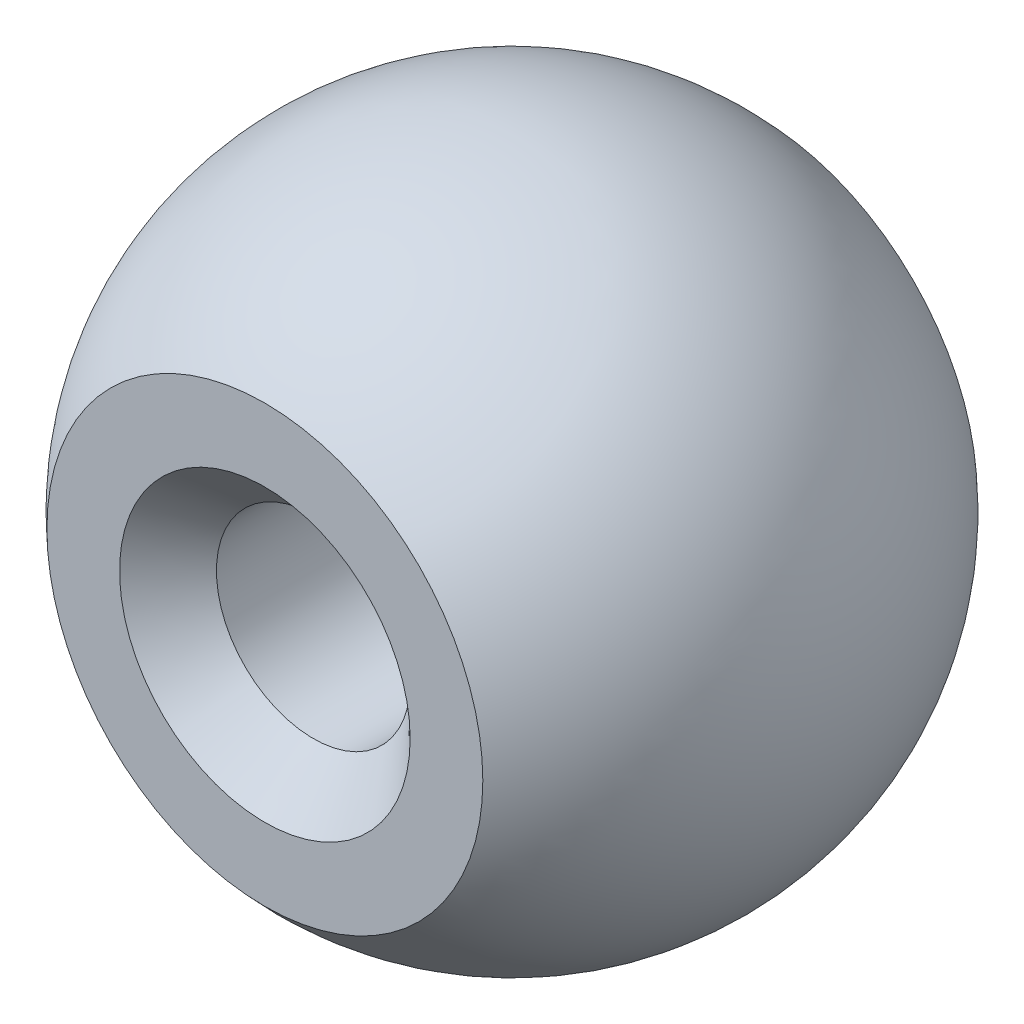
ISO-10303-21;
HEADER;
FILE_DESCRIPTION(('STEP AP214'),'2;1');
FILE_NAME('part.step','',(''),(''),'','','');
FILE_SCHEMA(('AUTOMOTIVE_DESIGN { 1 0 10303 214 1 1 1 1 }'));
ENDSEC;
DATA;
#1=APPLICATION_CONTEXT('core data for automotive mechanical design processes');
#2=APPLICATION_PROTOCOL_DEFINITION('international standard','automotive_design',2000,#1);
#3=PRODUCT_CONTEXT('',#1,'mechanical');
#4=PRODUCT('Part','Part','',(#3));
#5=PRODUCT_RELATED_PRODUCT_CATEGORY('part','',(#4));
#6=PRODUCT_DEFINITION_FORMATION('','',#4);
#7=PRODUCT_DEFINITION_CONTEXT('part definition',#1,'design');
#8=PRODUCT_DEFINITION('design','',#6,#7);
#9=PRODUCT_DEFINITION_SHAPE('','',#8);
#10=(LENGTH_UNIT() NAMED_UNIT(*) SI_UNIT(.MILLI.,.METRE.));
#11=(NAMED_UNIT(*) PLANE_ANGLE_UNIT() SI_UNIT($,.RADIAN.));
#12=(NAMED_UNIT(*) SI_UNIT($,.STERADIAN.) SOLID_ANGLE_UNIT());
#13=UNCERTAINTY_MEASURE_WITH_UNIT(LENGTH_MEASURE(1.E-05),#10,'distance_accuracy_value','');
#14=(GEOMETRIC_REPRESENTATION_CONTEXT(3) GLOBAL_UNCERTAINTY_ASSIGNED_CONTEXT((#13)) GLOBAL_UNIT_ASSIGNED_CONTEXT((#10,
#11,#12)) REPRESENTATION_CONTEXT('',''));
#15=CARTESIAN_POINT('',(0.,0.,0.));
#16=DIRECTION('',(0.,0.,1.));
#17=DIRECTION('',(1.,0.,0.));
#18=AXIS2_PLACEMENT_3D('',#15,#16,#17);
#19=CARTESIAN_POINT('',(0.,0.,-5.10252038562457));
#20=DIRECTION('',(0.,0.,-1.));
#21=DIRECTION('',(-1.,0.,0.));
#22=AXIS2_PLACEMENT_3D('',#19,#20,#21);
#23=PLANE('',#22);
#24=CARTESIAN_POINT('',(0.,0.,-5.10252038562457));
#25=DIRECTION('',(0.,0.,1.));
#26=DIRECTION('',(1.,0.,0.));
#27=AXIS2_PLACEMENT_3D('',#24,#25,#26);
#28=CIRCLE('',#27,2.);
#29=CARTESIAN_POINT('',(2.,0.,-5.10252038562457));
#30=VERTEX_POINT('',#29);
#31=EDGE_CURVE('E44',#30,#30,#28,.T.);
#32=ORIENTED_EDGE('',*,*,#31,.T.);
#33=EDGE_LOOP('',(#32));
#34=FACE_BOUND('',#33,.T.);
#35=CARTESIAN_POINT('',(0.,0.,-5.10252038562457));
#36=DIRECTION('',(0.,0.,1.));
#37=DIRECTION('',(1.,0.,0.));
#38=AXIS2_PLACEMENT_3D('',#35,#36,#37);
#39=CIRCLE('',#38,4.5);
#40=CARTESIAN_POINT('',(4.5,0.,-5.10252038562457));
#41=VERTEX_POINT('',#40);
#42=EDGE_CURVE('E40',#41,#41,#39,.T.);
#43=ORIENTED_EDGE('',*,*,#42,.F.);
#44=EDGE_LOOP('',(#43));
#45=FACE_BOUND('',#44,.T.);
#46=ADVANCED_FACE('F34',(#34,#45),#23,.T.);
#47=CARTESIAN_POINT('',(0.,0.,5.10252038562457));
#48=DIRECTION('',(0.,0.,1.));
#49=DIRECTION('',(1.,0.,0.));
#50=AXIS2_PLACEMENT_3D('',#47,#48,#49);
#51=PLANE('',#50);
#52=CARTESIAN_POINT('',(0.,0.,5.10252038562457));
#53=DIRECTION('',(0.,0.,1.));
#54=DIRECTION('',(1.,0.,0.));
#55=AXIS2_PLACEMENT_3D('',#52,#53,#54);
#56=CIRCLE('',#55,3.);
#57=CARTESIAN_POINT('',(3.,0.,5.10252038562457));
#58=VERTEX_POINT('',#57);
#59=EDGE_CURVE('E53',#58,#58,#56,.T.);
#60=ORIENTED_EDGE('',*,*,#59,.F.);
#61=EDGE_LOOP('',(#60));
#62=FACE_BOUND('',#61,.T.);
#63=CARTESIAN_POINT('',(0.,0.,5.10252038562457));
#64=DIRECTION('',(0.,0.,1.));
#65=DIRECTION('',(1.,0.,0.));
#66=AXIS2_PLACEMENT_3D('',#63,#64,#65);
#67=CIRCLE('',#66,4.5);
#68=CARTESIAN_POINT('',(4.5,0.,5.10252038562457));
#69=VERTEX_POINT('',#68);
#70=EDGE_CURVE('E10',#69,#69,#67,.T.);
#71=ORIENTED_EDGE('',*,*,#70,.T.);
#72=EDGE_LOOP('',(#71));
#73=FACE_BOUND('',#72,.T.);
#74=ADVANCED_FACE('F59',(#62,#73),#51,.T.);
#75=CARTESIAN_POINT('',(0.,0.,0.));
#76=DIRECTION('',(0.,0.,1.));
#77=DIRECTION('',(1.,0.,0.));
#78=AXIS2_PLACEMENT_3D('',#75,#76,#77);
#79=SPHERICAL_SURFACE('',#78,6.80336051416609);
#80=CARTESIAN_POINT('',(4.5,0.,-5.10252038562457));
#81=CARTESIAN_POINT('',(4.59015337255352,0.,-5.02301686365737));
#82=CARTESIAN_POINT('',(4.67819529523904,0.,-4.94111962845658));
#83=CARTESIAN_POINT('',(4.84981883325199,0.,-4.77277783394915));
#84=CARTESIAN_POINT('',(4.93340044857941,0.,-4.68633327464251));
#85=CARTESIAN_POINT('',(5.09586596425406,0.,-4.50913693428469));
#86=CARTESIAN_POINT('',(5.17474986460128,0.,-4.41838515323351));
#87=CARTESIAN_POINT('',(5.32759909425923,0.,-4.23282999200353));
#88=CARTESIAN_POINT('',(5.40156442356996,0.,-4.13802661182474));
#89=CARTESIAN_POINT('',(5.54436857068977,0.,-3.94463433788936));
#90=CARTESIAN_POINT('',(5.61320738849885,0.,-3.84604544413277));
#91=CARTESIAN_POINT('',(5.74556521226832,0.,-3.64535910687888));
#92=CARTESIAN_POINT('',(5.80908421822871,0.,-3.54326166338158));
#93=CARTESIAN_POINT('',(5.93062399541599,0.,-3.3358449792967));
#94=CARTESIAN_POINT('',(5.98864476664288,0.,-3.23052573870912));
#95=CARTESIAN_POINT('',(6.09902511196882,0.,-3.01696127996971));
#96=CARTESIAN_POINT('',(6.15138468606787,0.,-2.90871606181788));
#97=CARTESIAN_POINT('',(6.25029557101517,0.,-2.68960368109908));
#98=CARTESIAN_POINT('',(6.29684688186342,0.,-2.5787365185321));
#99=CARTESIAN_POINT('',(6.38401048940892,0.,-2.35469164779456));
#100=CARTESIAN_POINT('',(6.42462278610617,0.,-2.24151393962399));
#101=CARTESIAN_POINT('',(6.49979429534408,0.,-2.01316586590476));
#102=CARTESIAN_POINT('',(6.53435350788474,0.,-1.89799550035609));
#103=CARTESIAN_POINT('',(6.59732178051507,0.,-1.66598559708072));
#104=CARTESIAN_POINT('',(6.62573084060475,0.,-1.54914605935402));
#105=CARTESIAN_POINT('',(6.67631901427779,0.,-1.31412598519164));
#106=CARTESIAN_POINT('',(6.69849812786115,0.,-1.19594544875597));
#107=CARTESIAN_POINT('',(6.73656411285739,0.,-0.958575317186241));
#108=CARTESIAN_POINT('',(6.75245098427028,0.,-0.839385722052187));
#109=CARTESIAN_POINT('',(6.77788786261767,0.,-0.600332247291797));
#110=CARTESIAN_POINT('',(6.78743786955218,0.,-0.480468367665461));
#111=CARTESIAN_POINT('',(6.80017419532639,0.,-0.240402992026084));
#112=CARTESIAN_POINT('',(6.80336051416609,0.,-0.120201496013043));
#113=CARTESIAN_POINT('',(6.80336051416609,0.,0.12020149601304));
#114=CARTESIAN_POINT('',(6.80017419532639,0.,0.240402992026081));
#115=CARTESIAN_POINT('',(6.78743786955218,0.,0.480468367665458));
#116=CARTESIAN_POINT('',(6.77788786261768,0.,0.600332247291794));
#117=CARTESIAN_POINT('',(6.75245098427028,0.,0.839385722052183));
#118=CARTESIAN_POINT('',(6.73656411285739,0.,0.958575317186238));
#119=CARTESIAN_POINT('',(6.69849812786115,0.,1.19594544875596));
#120=CARTESIAN_POINT('',(6.67631901427779,0.,1.31412598519163));
#121=CARTESIAN_POINT('',(6.62573084060475,0.,1.54914605935401));
#122=CARTESIAN_POINT('',(6.59732178051507,0.,1.66598559708072));
#123=CARTESIAN_POINT('',(6.53435350788474,0.,1.89799550035609));
#124=CARTESIAN_POINT('',(6.49979429534408,0.,2.01316586590475));
#125=CARTESIAN_POINT('',(6.42462278610617,0.,2.24151393962398));
#126=CARTESIAN_POINT('',(6.38401048940892,0.,2.35469164779455));
#127=CARTESIAN_POINT('',(6.29684688186342,0.,2.5787365185321));
#128=CARTESIAN_POINT('',(6.25029557101517,0.,2.68960368109908));
#129=CARTESIAN_POINT('',(6.15138468606788,0.,2.90871606181788));
#130=CARTESIAN_POINT('',(6.09902511196882,0.,3.01696127996971));
#131=CARTESIAN_POINT('',(5.98864476664288,0.,3.23052573870912));
#132=CARTESIAN_POINT('',(5.93062399541599,0.,3.33584497929669));
#133=CARTESIAN_POINT('',(5.80908421822871,0.,3.54326166338158));
#134=CARTESIAN_POINT('',(5.74556521226832,0.,3.64535910687888));
#135=CARTESIAN_POINT('',(5.61320738849886,0.,3.84604544413277));
#136=CARTESIAN_POINT('',(5.54436857068978,0.,3.94463433788936));
#137=CARTESIAN_POINT('',(5.40156442356996,0.,4.13802661182474));
#138=CARTESIAN_POINT('',(5.32759909425923,0.,4.23282999200353));
#139=CARTESIAN_POINT('',(5.17474986460128,0.,4.41838515323351));
#140=CARTESIAN_POINT('',(5.09586596425406,0.,4.50913693428469));
#141=CARTESIAN_POINT('',(4.93340044857942,0.,4.68633327464251));
#142=CARTESIAN_POINT('',(4.84981883325199,0.,4.77277783394915));
#143=CARTESIAN_POINT('',(4.67819529523904,0.,4.94111962845658));
#144=CARTESIAN_POINT('',(4.59015337255352,0.,5.02301686365737));
#145=CARTESIAN_POINT('',(4.5,0.,5.10252038562457));
#146=B_SPLINE_CURVE_WITH_KNOTS('',3,(#80,#81,#82,#83,#84,#85,#86,#87,#88,#89,#90,#91,#92,#93,
#94,#95,#96,#97,#98,#99,#100,#101,#102,#103,#104,#105,#106,#107,#108,#109,#110,#111,#112,#113,
#114,#115,#116,#117,#118,#119,#120,#121,#122,#123,#124,#125,#126,#127,#128,#129,#130,#131,#132,
#133,#134,#135,#136,#137,#138,#139,#140,#141,#142,#143,#144,#145),.UNSPECIFIED.,.F.,.F.,(4,2,2,
2,2,2,2,2,2,2,2,2,2,2,2,2,2,2,2,2,2,2,2,2,2,2,2,2,2,2,2,2,4),(0.,0.360562293407049,
0.721124586814099,1.08168688022115,1.4422491736282,1.80281146703525,2.1633737604423,
2.52393605384935,2.88449834725639,3.24506064066344,3.60562293407049,3.96618522747754,
4.32674752088459,4.68730981429164,5.04787210769869,5.40843440110574,5.76899669451279,
6.12955898791984,6.49012128132689,6.85068357473394,7.21124586814099,7.57180816154804,
7.93237045495509,8.29293274836214,8.65349504176919,9.01405733517624,9.37461962858329,
9.73518192199033,10.0957442153974,10.4563065088044,10.8168688022115,11.1774310956185,
11.5379933890256),.UNSPECIFIED.);
#147=EDGE_CURVE('BSEAM61',#41,#69,#146,.T.);
#148=ORIENTED_EDGE('',*,*,#42,.T.);
#149=ORIENTED_EDGE('',*,*,#70,.F.);
#150=ORIENTED_EDGE('',*,*,#147,.T.);
#151=ORIENTED_EDGE('',*,*,#147,.F.);
#152=EDGE_LOOP('',(#148,#150,#149,#151));
#153=FACE_BOUND('',#152,.T.);
#154=ADVANCED_FACE('F61',(#153),#79,.T.);
#155=CARTESIAN_POINT('',(0.,0.,5.10252038562457));
#156=DIRECTION('',(0.,0.,1.));
#157=DIRECTION('',(1.,0.,0.));
#158=AXIS2_PLACEMENT_3D('',#155,#156,#157);
#159=CYLINDRICAL_SURFACE('',#158,2.);
#160=ORIENTED_EDGE('',*,*,#31,.F.);
#161=EDGE_LOOP('',(#160));
#162=FACE_BOUND('',#161,.T.);
#163=CARTESIAN_POINT('',(0.,0.,4.10252038562457));
#164=DIRECTION('',(0.,0.,1.));
#165=DIRECTION('',(1.,0.,0.));
#166=AXIS2_PLACEMENT_3D('',#163,#164,#165);
#167=CIRCLE('',#166,2.);
#168=CARTESIAN_POINT('',(2.,0.,4.10252038562457));
#169=VERTEX_POINT('',#168);
#170=EDGE_CURVE('E48',#169,#169,#167,.T.);
#171=ORIENTED_EDGE('',*,*,#170,.T.);
#172=EDGE_LOOP('',(#171));
#173=FACE_BOUND('',#172,.T.);
#174=ADVANCED_FACE('F66',(#162,#173),#159,.F.);
#175=CARTESIAN_POINT('',(0.,0.,5.10252038562457));
#176=DIRECTION('',(0.,0.,1.));
#177=DIRECTION('',(1.,0.,0.));
#178=AXIS2_PLACEMENT_3D('',#175,#176,#177);
#179=CONICAL_SURFACE('',#178,3.,0.785398163397448);
#180=ORIENTED_EDGE('',*,*,#170,.F.);
#181=EDGE_LOOP('',(#180));
#182=FACE_BOUND('',#181,.T.);
#183=ORIENTED_EDGE('',*,*,#59,.T.);
#184=EDGE_LOOP('',(#183));
#185=FACE_BOUND('',#184,.T.);
#186=ADVANCED_FACE('F57',(#182,#185),#179,.F.);
#187=CLOSED_SHELL('',(#46,#74,#154,#174,#186));
#188=MANIFOLD_SOLID_BREP('B2',#187);
#189=ADVANCED_BREP_SHAPE_REPRESENTATION('',(#18,#188),#14);
#190=SHAPE_DEFINITION_REPRESENTATION(#9,#189);
ENDSEC;
END-ISO-10303-21;
